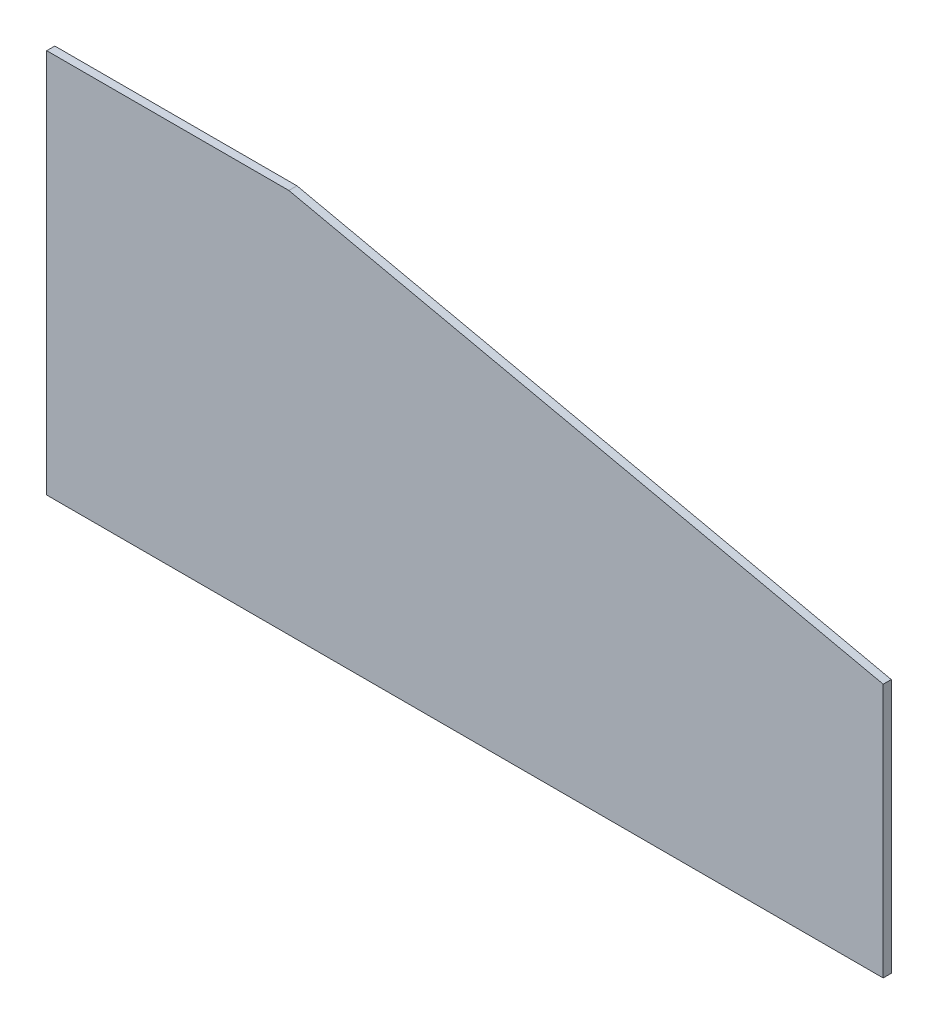
ISO-10303-21;
HEADER;
FILE_DESCRIPTION(('STEP AP214'),'2;1');
FILE_NAME('part.step','',(''),(''),'','','');
FILE_SCHEMA(('AUTOMOTIVE_DESIGN { 1 0 10303 214 1 1 1 1 }'));
ENDSEC;
DATA;
#1=APPLICATION_CONTEXT('core data for automotive mechanical design processes');
#2=APPLICATION_PROTOCOL_DEFINITION('international standard','automotive_design',2000,#1);
#3=PRODUCT_CONTEXT('',#1,'mechanical');
#4=PRODUCT('Part','Part','',(#3));
#5=PRODUCT_RELATED_PRODUCT_CATEGORY('part','',(#4));
#6=PRODUCT_DEFINITION_FORMATION('','',#4);
#7=PRODUCT_DEFINITION_CONTEXT('part definition',#1,'design');
#8=PRODUCT_DEFINITION('design','',#6,#7);
#9=PRODUCT_DEFINITION_SHAPE('','',#8);
#10=(LENGTH_UNIT() NAMED_UNIT(*) SI_UNIT(.MILLI.,.METRE.));
#11=(NAMED_UNIT(*) PLANE_ANGLE_UNIT() SI_UNIT($,.RADIAN.));
#12=(NAMED_UNIT(*) SI_UNIT($,.STERADIAN.) SOLID_ANGLE_UNIT());
#13=UNCERTAINTY_MEASURE_WITH_UNIT(LENGTH_MEASURE(1.E-05),#10,'distance_accuracy_value','');
#14=(GEOMETRIC_REPRESENTATION_CONTEXT(3) GLOBAL_UNCERTAINTY_ASSIGNED_CONTEXT((#13)) GLOBAL_UNIT_ASSIGNED_CONTEXT((#10,
#11,#12)) REPRESENTATION_CONTEXT('',''));
#15=CARTESIAN_POINT('',(0.,0.,0.));
#16=DIRECTION('',(0.,0.,1.));
#17=DIRECTION('',(1.,0.,0.));
#18=AXIS2_PLACEMENT_3D('',#15,#16,#17);
#19=CARTESIAN_POINT('',(1315.,4.91338006875447E-12,12.7));
#20=DIRECTION('',(0.,1.,0.));
#21=DIRECTION('',(-1.,0.,0.));
#22=AXIS2_PLACEMENT_3D('',#19,#20,#21);
#23=PLANE('',#22);
#24=DIRECTION('',(1.,0.,0.));
#25=VECTOR('',#24,1.);
#26=CARTESIAN_POINT('',(1315.,4.91338006875447E-12,0.));
#27=LINE('',#26,#25);
#28=CARTESIAN_POINT('',(0.,0.,0.));
#29=VERTEX_POINT('',#28);
#30=CARTESIAN_POINT('',(1315.,4.91338006875447E-12,0.));
#31=VERTEX_POINT('',#30);
#32=EDGE_CURVE('E118',#29,#31,#27,.T.);
#33=ORIENTED_EDGE('',*,*,#32,.T.);
#34=DIRECTION('',(0.,0.,-1.));
#35=VECTOR('',#34,1.);
#36=CARTESIAN_POINT('',(1315.,4.91338006875447E-12,12.7));
#37=LINE('',#36,#35);
#38=CARTESIAN_POINT('',(1315.,4.91338006875447E-12,12.7));
#39=VERTEX_POINT('',#38);
#40=EDGE_CURVE('E11',#39,#31,#37,.T.);
#41=ORIENTED_EDGE('',*,*,#40,.F.);
#42=DIRECTION('',(1.,0.,0.));
#43=VECTOR('',#42,1.);
#44=CARTESIAN_POINT('',(1315.,4.91338006875447E-12,12.7));
#45=LINE('',#44,#43);
#46=CARTESIAN_POINT('',(0.,0.,12.7));
#47=VERTEX_POINT('',#46);
#48=EDGE_CURVE('E131',#47,#39,#45,.T.);
#49=ORIENTED_EDGE('',*,*,#48,.F.);
#50=DIRECTION('',(0.,0.,-1.));
#51=VECTOR('',#50,1.);
#52=CARTESIAN_POINT('',(0.,0.,12.7));
#53=LINE('',#52,#51);
#54=EDGE_CURVE('E114',#47,#29,#53,.T.);
#55=ORIENTED_EDGE('',*,*,#54,.T.);
#56=EDGE_LOOP('',(#33,#41,#49,#55));
#57=FACE_BOUND('',#56,.T.);
#58=ADVANCED_FACE('F39',(#57),#23,.F.);
#59=CARTESIAN_POINT('',(1315.,400.000000000005,12.7));
#60=DIRECTION('',(-1.,0.,0.));
#61=DIRECTION('',(0.,0.,1.));
#62=AXIS2_PLACEMENT_3D('',#59,#60,#61);
#63=PLANE('',#62);
#64=DIRECTION('',(0.,1.,0.));
#65=VECTOR('',#64,1.);
#66=CARTESIAN_POINT('',(1315.,400.000000000005,0.));
#67=LINE('',#66,#65);
#68=CARTESIAN_POINT('',(1315.,400.000000000005,0.));
#69=VERTEX_POINT('',#68);
#70=EDGE_CURVE('E122',#31,#69,#67,.T.);
#71=ORIENTED_EDGE('',*,*,#70,.T.);
#72=DIRECTION('',(0.,0.,-1.));
#73=VECTOR('',#72,1.);
#74=CARTESIAN_POINT('',(1315.,400.000000000005,12.7));
#75=LINE('',#74,#73);
#76=CARTESIAN_POINT('',(1315.,400.000000000005,12.7));
#77=VERTEX_POINT('',#76);
#78=EDGE_CURVE('E48',#77,#69,#75,.T.);
#79=ORIENTED_EDGE('',*,*,#78,.F.);
#80=DIRECTION('',(0.,1.,0.));
#81=VECTOR('',#80,1.);
#82=CARTESIAN_POINT('',(1315.,400.000000000005,12.7));
#83=LINE('',#82,#81);
#84=EDGE_CURVE('E90',#39,#77,#83,.T.);
#85=ORIENTED_EDGE('',*,*,#84,.F.);
#86=ORIENTED_EDGE('',*,*,#40,.T.);
#87=EDGE_LOOP('',(#71,#79,#85,#86));
#88=FACE_BOUND('',#87,.T.);
#89=ADVANCED_FACE('F153',(#88),#63,.F.);
#90=CARTESIAN_POINT('',(380.662838908253,604.999999999999,12.7));
#91=DIRECTION('',(-0.214309153065047,-0.976765881320873,0.));
#92=DIRECTION('',(0.976765881320873,-0.214309153065047,0.));
#93=AXIS2_PLACEMENT_3D('',#90,#91,#92);
#94=PLANE('',#93);
#95=DIRECTION('',(-0.976765881320873,0.214309153065047,0.));
#96=VECTOR('',#95,1.);
#97=CARTESIAN_POINT('',(380.662838908253,604.999999999999,0.));
#98=LINE('',#97,#96);
#99=CARTESIAN_POINT('',(380.662838908253,604.999999999999,0.));
#100=VERTEX_POINT('',#99);
#101=EDGE_CURVE('E106',#69,#100,#98,.T.);
#102=ORIENTED_EDGE('',*,*,#101,.T.);
#103=DIRECTION('',(0.,0.,-1.));
#104=VECTOR('',#103,1.);
#105=CARTESIAN_POINT('',(380.662838908253,604.999999999999,12.7));
#106=LINE('',#105,#104);
#107=CARTESIAN_POINT('',(380.662838908253,604.999999999999,12.7));
#108=VERTEX_POINT('',#107);
#109=EDGE_CURVE('E103',#108,#100,#106,.T.);
#110=ORIENTED_EDGE('',*,*,#109,.F.);
#111=DIRECTION('',(-0.976765881320873,0.214309153065047,0.));
#112=VECTOR('',#111,1.);
#113=CARTESIAN_POINT('',(380.662838908253,604.999999999999,12.7));
#114=LINE('',#113,#112);
#115=EDGE_CURVE('E94',#77,#108,#114,.T.);
#116=ORIENTED_EDGE('',*,*,#115,.F.);
#117=ORIENTED_EDGE('',*,*,#78,.T.);
#118=EDGE_LOOP('',(#102,#110,#116,#117));
#119=FACE_BOUND('',#118,.T.);
#120=ADVANCED_FACE('F104',(#119),#94,.F.);
#121=CARTESIAN_POINT('',(0.,605.,12.7));
#122=DIRECTION('',(0.,-1.,0.));
#123=DIRECTION('',(1.,0.,0.));
#124=AXIS2_PLACEMENT_3D('',#121,#122,#123);
#125=PLANE('',#124);
#126=DIRECTION('',(-1.,0.,0.));
#127=VECTOR('',#126,1.);
#128=CARTESIAN_POINT('',(0.,605.,0.));
#129=LINE('',#128,#127);
#130=CARTESIAN_POINT('',(0.,605.,0.));
#131=VERTEX_POINT('',#130);
#132=EDGE_CURVE('E76',#100,#131,#129,.T.);
#133=ORIENTED_EDGE('',*,*,#132,.T.);
#134=DIRECTION('',(0.,0.,-1.));
#135=VECTOR('',#134,1.);
#136=CARTESIAN_POINT('',(0.,605.,12.7));
#137=LINE('',#136,#135);
#138=CARTESIAN_POINT('',(0.,605.,12.7));
#139=VERTEX_POINT('',#138);
#140=EDGE_CURVE('E108',#139,#131,#137,.T.);
#141=ORIENTED_EDGE('',*,*,#140,.F.);
#142=DIRECTION('',(-1.,0.,0.));
#143=VECTOR('',#142,1.);
#144=CARTESIAN_POINT('',(0.,605.,12.7));
#145=LINE('',#144,#143);
#146=EDGE_CURVE('E98',#108,#139,#145,.T.);
#147=ORIENTED_EDGE('',*,*,#146,.F.);
#148=ORIENTED_EDGE('',*,*,#109,.T.);
#149=EDGE_LOOP('',(#133,#141,#147,#148));
#150=FACE_BOUND('',#149,.T.);
#151=ADVANCED_FACE('F110',(#150),#125,.F.);
#152=CARTESIAN_POINT('',(0.,0.,12.7));
#153=DIRECTION('',(1.,0.,0.));
#154=DIRECTION('',(0.,0.,-1.));
#155=AXIS2_PLACEMENT_3D('',#152,#153,#154);
#156=PLANE('',#155);
#157=DIRECTION('',(0.,-1.,0.));
#158=VECTOR('',#157,1.);
#159=CARTESIAN_POINT('',(0.,0.,0.));
#160=LINE('',#159,#158);
#161=EDGE_CURVE('E82',#131,#29,#160,.T.);
#162=ORIENTED_EDGE('',*,*,#161,.T.);
#163=ORIENTED_EDGE('',*,*,#54,.F.);
#164=DIRECTION('',(0.,-1.,0.));
#165=VECTOR('',#164,1.);
#166=CARTESIAN_POINT('',(0.,0.,12.7));
#167=LINE('',#166,#165);
#168=EDGE_CURVE('E56',#139,#47,#167,.T.);
#169=ORIENTED_EDGE('',*,*,#168,.F.);
#170=ORIENTED_EDGE('',*,*,#140,.T.);
#171=EDGE_LOOP('',(#162,#163,#169,#170));
#172=FACE_BOUND('',#171,.T.);
#173=ADVANCED_FACE('F142',(#172),#156,.F.);
#174=CARTESIAN_POINT('',(0.,0.,12.7));
#175=DIRECTION('',(0.,0.,-1.));
#176=DIRECTION('',(-1.,0.,0.));
#177=AXIS2_PLACEMENT_3D('',#174,#175,#176);
#178=PLANE('',#177);
#179=ORIENTED_EDGE('',*,*,#48,.T.);
#180=ORIENTED_EDGE('',*,*,#84,.T.);
#181=ORIENTED_EDGE('',*,*,#115,.T.);
#182=ORIENTED_EDGE('',*,*,#146,.T.);
#183=ORIENTED_EDGE('',*,*,#168,.T.);
#184=EDGE_LOOP('',(#179,#180,#181,#182,#183));
#185=FACE_BOUND('',#184,.T.);
#186=ADVANCED_FACE('F96',(#185),#178,.F.);
#187=CARTESIAN_POINT('',(0.,0.,0.));
#188=DIRECTION('',(0.,0.,-1.));
#189=DIRECTION('',(-1.,0.,0.));
#190=AXIS2_PLACEMENT_3D('',#187,#188,#189);
#191=PLANE('',#190);
#192=ORIENTED_EDGE('',*,*,#32,.F.);
#193=ORIENTED_EDGE('',*,*,#161,.F.);
#194=ORIENTED_EDGE('',*,*,#132,.F.);
#195=ORIENTED_EDGE('',*,*,#101,.F.);
#196=ORIENTED_EDGE('',*,*,#70,.F.);
#197=EDGE_LOOP('',(#192,#193,#194,#195,#196));
#198=FACE_BOUND('',#197,.T.);
#199=ADVANCED_FACE('F138',(#198),#191,.T.);
#200=CLOSED_SHELL('',(#58,#89,#120,#151,#173,#186,#199));
#201=MANIFOLD_SOLID_BREP('B2',#200);
#202=ADVANCED_BREP_SHAPE_REPRESENTATION('',(#18,#201),#14);
#203=SHAPE_DEFINITION_REPRESENTATION(#9,#202);
ENDSEC;
END-ISO-10303-21;
